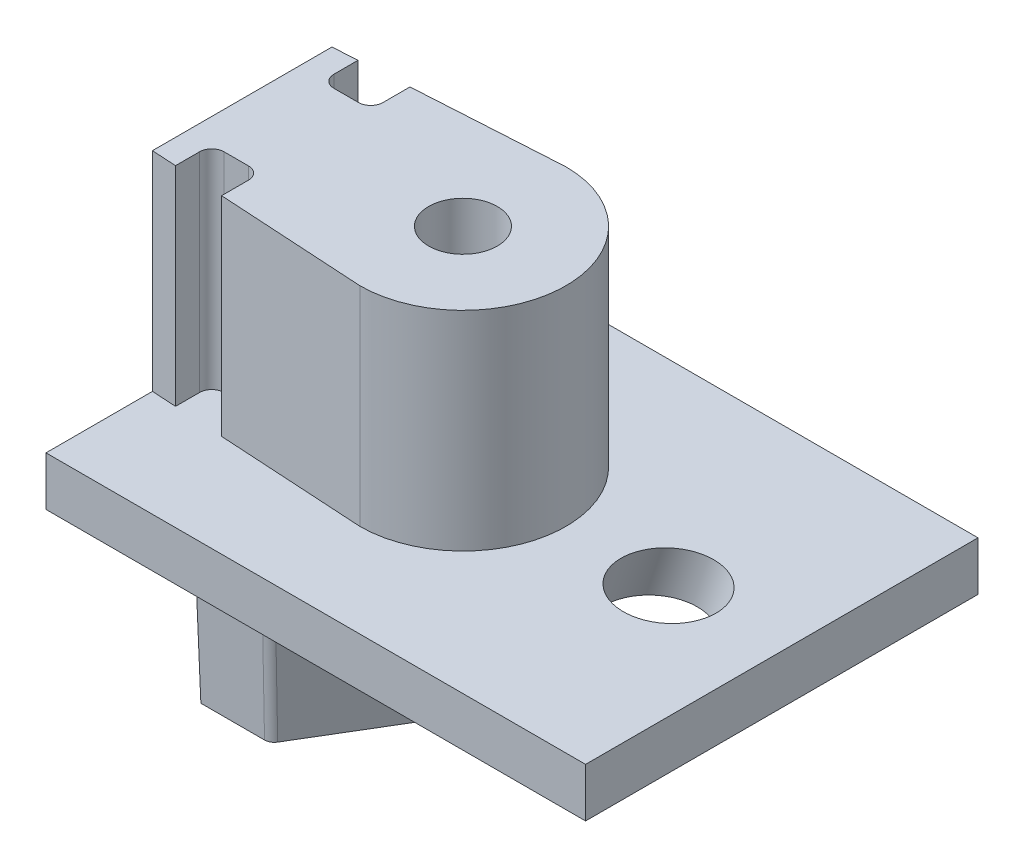
ISO-10303-21;
HEADER;
FILE_DESCRIPTION(('STEP AP214'),'2;1');
FILE_NAME('part.step','',(''),(''),'','','');
FILE_SCHEMA(('AUTOMOTIVE_DESIGN { 1 0 10303 214 1 1 1 1 }'));
ENDSEC;
DATA;
#1=APPLICATION_CONTEXT('core data for automotive mechanical design processes');
#2=APPLICATION_PROTOCOL_DEFINITION('international standard','automotive_design',2000,#1);
#3=PRODUCT_CONTEXT('',#1,'mechanical');
#4=PRODUCT('Part','Part','',(#3));
#5=PRODUCT_RELATED_PRODUCT_CATEGORY('part','',(#4));
#6=PRODUCT_DEFINITION_FORMATION('','',#4);
#7=PRODUCT_DEFINITION_CONTEXT('part definition',#1,'design');
#8=PRODUCT_DEFINITION('design','',#6,#7);
#9=PRODUCT_DEFINITION_SHAPE('','',#8);
#10=(LENGTH_UNIT() NAMED_UNIT(*) SI_UNIT(.MILLI.,.METRE.));
#11=(NAMED_UNIT(*) PLANE_ANGLE_UNIT() SI_UNIT($,.RADIAN.));
#12=(NAMED_UNIT(*) SI_UNIT($,.STERADIAN.) SOLID_ANGLE_UNIT());
#13=UNCERTAINTY_MEASURE_WITH_UNIT(LENGTH_MEASURE(1.E-05),#10,'distance_accuracy_value','');
#14=(GEOMETRIC_REPRESENTATION_CONTEXT(3) GLOBAL_UNCERTAINTY_ASSIGNED_CONTEXT((#13)) GLOBAL_UNIT_ASSIGNED_CONTEXT((#10,
#11,#12)) REPRESENTATION_CONTEXT('',''));
#15=CARTESIAN_POINT('',(0.,0.,0.));
#16=DIRECTION('',(0.,0.,1.));
#17=DIRECTION('',(1.,0.,0.));
#18=AXIS2_PLACEMENT_3D('',#15,#16,#17);
#19=CARTESIAN_POINT('',(0.,-0.5,0.));
#20=DIRECTION('',(0.,-1.,0.));
#21=DIRECTION('',(0.,0.,-1.));
#22=AXIS2_PLACEMENT_3D('',#19,#20,#21);
#23=PLANE('',#22);
#24=DIRECTION('',(-1.,0.,0.));
#25=VECTOR('',#24,1.);
#26=CARTESIAN_POINT('',(1.75,-0.5,-2.));
#27=LINE('',#26,#25);
#28=CARTESIAN_POINT('',(3.25,-0.5,-2.));
#29=VERTEX_POINT('',#28);
#30=CARTESIAN_POINT('',(-2.25,-0.5,-2.));
#31=VERTEX_POINT('',#30);
#32=EDGE_CURVE('E421',#29,#31,#27,.T.);
#33=ORIENTED_EDGE('',*,*,#32,.F.);
#34=DIRECTION('',(0.,0.,-1.));
#35=VECTOR('',#34,1.);
#36=CARTESIAN_POINT('',(3.25,-0.5,-2.));
#37=LINE('',#36,#35);
#38=CARTESIAN_POINT('',(3.25,-0.5,2.));
#39=VERTEX_POINT('',#38);
#40=EDGE_CURVE('E429',#39,#29,#37,.T.);
#41=ORIENTED_EDGE('',*,*,#40,.F.);
#42=DIRECTION('',(1.,0.,0.));
#43=VECTOR('',#42,1.);
#44=CARTESIAN_POINT('',(-2.25,-0.5,2.));
#45=LINE('',#44,#43);
#46=CARTESIAN_POINT('',(-2.25,-0.5,2.));
#47=VERTEX_POINT('',#46);
#48=EDGE_CURVE('E427',#47,#39,#45,.T.);
#49=ORIENTED_EDGE('',*,*,#48,.F.);
#50=DIRECTION('',(0.,0.,1.));
#51=VECTOR('',#50,1.);
#52=CARTESIAN_POINT('',(-2.25,-0.5,2.));
#53=LINE('',#52,#51);
#54=EDGE_CURVE('E423',#31,#47,#53,.T.);
#55=ORIENTED_EDGE('',*,*,#54,.F.);
#56=EDGE_LOOP('',(#33,#41,#49,#55));
#57=FACE_BOUND('',#56,.T.);
#58=CARTESIAN_POINT('',(1.92880187929405,-0.5,0.));
#59=DIRECTION('',(0.,-1.,0.));
#60=DIRECTION('',(1.,0.,0.));
#61=AXIS2_PLACEMENT_3D('',#58,#59,#60);
#62=ELLIPSE('',#61,0.484882574559151,0.46);
#63=CARTESIAN_POINT('',(2.4136844538532,-0.5,0.));
#64=VERTEX_POINT('',#63);
#65=EDGE_CURVE('E243',#64,#64,#62,.T.);
#66=ORIENTED_EDGE('',*,*,#65,.F.);
#67=EDGE_LOOP('',(#66));
#68=FACE_BOUND('',#67,.T.);
#69=DIRECTION('',(1.,0.,0.));
#70=VECTOR('',#69,1.);
#71=CARTESIAN_POINT('',(0.,-0.5,1.24781695285458));
#72=LINE('',#71,#70);
#73=CARTESIAN_POINT('',(-1.5,-0.5,1.24781695285457));
#74=VERTEX_POINT('',#73);
#75=CARTESIAN_POINT('',(-0.807801169409156,-0.5,1.24781695285457));
#76=VERTEX_POINT('',#75);
#77=EDGE_CURVE('E358',#74,#76,#72,.T.);
#78=ORIENTED_EDGE('',*,*,#77,.T.);
#79=CARTESIAN_POINT('',(-0.807908998304848,-0.5,1.14772168433824));
#80=DIRECTION('',(0.,-1.,0.));
#81=DIRECTION('',(-0.492698814983595,0.,-0.870199906753478));
#82=AXIS2_PLACEMENT_3D('',#79,#80,#81);
#83=ELLIPSE('',#82,0.100125789704708,0.1);
#84=CARTESIAN_POINT('',(-0.722133491163942,-0.5,1.19931273764352));
#85=VERTEX_POINT('',#84);
#86=EDGE_CURVE('E47',#76,#85,#83,.F.);
#87=ORIENTED_EDGE('',*,*,#86,.T.);
#88=DIRECTION('',(0.514495755427527,0.,-0.857492925712544));
#89=VECTOR('',#88,1.);
#90=CARTESIAN_POINT('',(-0.00187194748369955,-0.5,-0.00112316849021973));
#91=LINE('',#90,#89);
#92=CARTESIAN_POINT('',(-0.0661741084451111,-0.5,0.1060470997788));
#93=VERTEX_POINT('',#92);
#94=EDGE_CURVE('E356',#85,#93,#91,.T.);
#95=ORIENTED_EDGE('',*,*,#94,.T.);
#96=CARTESIAN_POINT('',(0.,-0.5,0.));
#97=DIRECTION('',(0.,-1.,0.));
#98=DIRECTION('',(0.,0.,-1.));
#99=AXIS2_PLACEMENT_3D('',#96,#97,#98);
#100=CIRCLE('',#99,0.125);
#101=CARTESIAN_POINT('',(-0.0661741084451112,-0.5,-0.1060470997788));
#102=VERTEX_POINT('',#101);
#103=EDGE_CURVE('E361',#93,#102,#100,.F.);
#104=ORIENTED_EDGE('',*,*,#103,.T.);
#105=DIRECTION('',(-0.514495755427526,0.,-0.857492925712544));
#106=VECTOR('',#105,1.);
#107=CARTESIAN_POINT('',(-0.00187194748369962,-0.5,0.00112316849021978));
#108=LINE('',#107,#106);
#109=CARTESIAN_POINT('',(-0.722133491163942,-0.5,-1.19931273764352));
#110=VERTEX_POINT('',#109);
#111=EDGE_CURVE('E353',#102,#110,#108,.T.);
#112=ORIENTED_EDGE('',*,*,#111,.T.);
#113=CARTESIAN_POINT('',(-0.807908998304848,-0.5,-1.14772168433824));
#114=DIRECTION('',(0.,-1.,0.));
#115=DIRECTION('',(-0.492698814983592,0.,0.87019990675348));
#116=AXIS2_PLACEMENT_3D('',#113,#114,#115);
#117=ELLIPSE('',#116,0.100125789704708,0.1);
#118=CARTESIAN_POINT('',(-0.807801169409156,-0.5,-1.24781695285457));
#119=VERTEX_POINT('',#118);
#120=EDGE_CURVE('E11',#110,#119,#117,.F.);
#121=ORIENTED_EDGE('',*,*,#120,.T.);
#122=DIRECTION('',(-1.,0.,0.));
#123=VECTOR('',#122,1.);
#124=CARTESIAN_POINT('',(0.,-0.5,-1.24781695285457));
#125=LINE('',#124,#123);
#126=CARTESIAN_POINT('',(-1.5,-0.5,-1.24781695285457));
#127=VERTEX_POINT('',#126);
#128=EDGE_CURVE('E351',#119,#127,#125,.T.);
#129=ORIENTED_EDGE('',*,*,#128,.T.);
#130=DIRECTION('',(0.,0.,-1.));
#131=VECTOR('',#130,1.);
#132=CARTESIAN_POINT('',(-1.5,-0.5,1.25));
#133=LINE('',#132,#131);
#134=EDGE_CURVE('E365',#74,#127,#133,.T.);
#135=ORIENTED_EDGE('',*,*,#134,.F.);
#136=EDGE_LOOP('',(#78,#87,#95,#104,#112,#121,#129,#135));
#137=FACE_BOUND('',#136,.T.);
#138=ADVANCED_FACE('F39',(#57,#68,#137),#23,.T.);
#139=CARTESIAN_POINT('',(-2.50000000000002,2.125,0.9));
#140=DIRECTION('',(0.0598922907279451,0.,-0.998204845465779));
#141=DIRECTION('',(-0.998204845465779,0.,-0.0598922907279451));
#142=AXIS2_PLACEMENT_3D('',#139,#140,#141);
#143=PLANE('',#142);
#144=DIRECTION('',(0.998204845465779,0.,0.0598922907279451));
#145=VECTOR('',#144,1.);
#146=CARTESIAN_POINT('',(-2.50000000000002,2.125,0.9));
#147=LINE('',#146,#145);
#148=CARTESIAN_POINT('',(-2.25,2.125,0.915000000000001));
#149=VERTEX_POINT('',#148);
#150=CARTESIAN_POINT('',(-2.,2.125,0.93));
#151=VERTEX_POINT('',#150);
#152=EDGE_CURVE('E282',#149,#151,#147,.T.);
#153=ORIENTED_EDGE('',*,*,#152,.F.);
#154=DIRECTION('',(0.,-1.,0.));
#155=VECTOR('',#154,1.);
#156=CARTESIAN_POINT('',(-2.25,2.125,0.915000000000001));
#157=LINE('',#156,#155);
#158=CARTESIAN_POINT('',(-2.25,0.,0.915000000000001));
#159=VERTEX_POINT('',#158);
#160=EDGE_CURVE('E230',#149,#159,#157,.T.);
#161=ORIENTED_EDGE('',*,*,#160,.T.);
#162=DIRECTION('',(0.998204845465779,0.,0.0598922907279451));
#163=VECTOR('',#162,1.);
#164=CARTESIAN_POINT('',(-2.50000000000002,0.,0.9));
#165=LINE('',#164,#163);
#166=CARTESIAN_POINT('',(-2.,0.,0.93));
#167=VERTEX_POINT('',#166);
#168=EDGE_CURVE('E257',#159,#167,#165,.T.);
#169=ORIENTED_EDGE('',*,*,#168,.T.);
#170=DIRECTION('',(0.,-1.,0.));
#171=VECTOR('',#170,1.);
#172=CARTESIAN_POINT('',(-2.,2.125,0.93));
#173=LINE('',#172,#171);
#174=EDGE_CURVE('E295',#151,#167,#173,.T.);
#175=ORIENTED_EDGE('',*,*,#174,.F.);
#176=EDGE_LOOP('',(#153,#161,#169,#175));
#177=FACE_BOUND('',#176,.T.);
#178=ADVANCED_FACE('F533',(#177),#143,.F.);
#179=CARTESIAN_POINT('',(-2.,2.125,0.93));
#180=DIRECTION('',(-1.,0.,0.));
#181=DIRECTION('',(0.,0.,1.));
#182=AXIS2_PLACEMENT_3D('',#179,#180,#181);
#183=PLANE('',#182);
#184=DIRECTION('',(0.,0.,-1.));
#185=VECTOR('',#184,1.);
#186=CARTESIAN_POINT('',(-2.,0.,0.93));
#187=LINE('',#186,#185);
#188=CARTESIAN_POINT('',(-2.,0.,0.685));
#189=VERTEX_POINT('',#188);
#190=EDGE_CURVE('E260',#167,#189,#187,.T.);
#191=ORIENTED_EDGE('',*,*,#190,.T.);
#192=DIRECTION('',(0.,-1.,0.));
#193=VECTOR('',#192,1.);
#194=CARTESIAN_POINT('',(-2.,2.125,0.685));
#195=LINE('',#194,#193);
#196=CARTESIAN_POINT('',(-2.,2.125,0.685));
#197=VERTEX_POINT('',#196);
#198=EDGE_CURVE('E303',#189,#197,#195,.F.);
#199=ORIENTED_EDGE('',*,*,#198,.T.);
#200=DIRECTION('',(0.,0.,-1.));
#201=VECTOR('',#200,1.);
#202=CARTESIAN_POINT('',(-2.,2.125,0.93));
#203=LINE('',#202,#201);
#204=EDGE_CURVE('E458',#151,#197,#203,.T.);
#205=ORIENTED_EDGE('',*,*,#204,.F.);
#206=ORIENTED_EDGE('',*,*,#174,.T.);
#207=EDGE_LOOP('',(#191,#199,#205,#206));
#208=FACE_BOUND('',#207,.T.);
#209=ADVANCED_FACE('F530',(#208),#183,.F.);
#210=CARTESIAN_POINT('',(-1.5,2.125,0.56));
#211=DIRECTION('',(0.,0.,1.));
#212=DIRECTION('',(1.,0.,0.));
#213=AXIS2_PLACEMENT_3D('',#210,#211,#212);
#214=PLANE('',#213);
#215=DIRECTION('',(-1.,0.,0.));
#216=VECTOR('',#215,1.);
#217=CARTESIAN_POINT('',(-1.5,2.125,0.56));
#218=LINE('',#217,#216);
#219=CARTESIAN_POINT('',(-1.625,2.125,0.56));
#220=VERTEX_POINT('',#219);
#221=CARTESIAN_POINT('',(-1.875,2.125,0.56));
#222=VERTEX_POINT('',#221);
#223=EDGE_CURVE('E461',#220,#222,#218,.T.);
#224=ORIENTED_EDGE('',*,*,#223,.T.);
#225=DIRECTION('',(0.,-1.,0.));
#226=VECTOR('',#225,1.);
#227=CARTESIAN_POINT('',(-1.875,2.125,0.56));
#228=LINE('',#227,#226);
#229=CARTESIAN_POINT('',(-1.875,0.,0.56));
#230=VERTEX_POINT('',#229);
#231=EDGE_CURVE('E300',#222,#230,#228,.T.);
#232=ORIENTED_EDGE('',*,*,#231,.T.);
#233=DIRECTION('',(-1.,0.,0.));
#234=VECTOR('',#233,1.);
#235=CARTESIAN_POINT('',(-1.5,0.,0.56));
#236=LINE('',#235,#234);
#237=CARTESIAN_POINT('',(-1.625,0.,0.56));
#238=VERTEX_POINT('',#237);
#239=EDGE_CURVE('E264',#238,#230,#236,.T.);
#240=ORIENTED_EDGE('',*,*,#239,.F.);
#241=DIRECTION('',(0.,-1.,0.));
#242=VECTOR('',#241,1.);
#243=CARTESIAN_POINT('',(-1.625,2.125,0.56));
#244=LINE('',#243,#242);
#245=EDGE_CURVE('E298',#238,#220,#244,.F.);
#246=ORIENTED_EDGE('',*,*,#245,.T.);
#247=EDGE_LOOP('',(#224,#232,#240,#246));
#248=FACE_BOUND('',#247,.T.);
#249=ADVANCED_FACE('F520',(#248),#214,.T.);
#250=CARTESIAN_POINT('',(-1.5,2.125,0.56));
#251=DIRECTION('',(1.,0.,0.));
#252=DIRECTION('',(0.,0.,-1.));
#253=AXIS2_PLACEMENT_3D('',#250,#251,#252);
#254=PLANE('',#253);
#255=DIRECTION('',(0.,0.,1.));
#256=VECTOR('',#255,1.);
#257=CARTESIAN_POINT('',(-1.5,2.125,0.56));
#258=LINE('',#257,#256);
#259=CARTESIAN_POINT('',(-1.5,2.125,0.685));
#260=VERTEX_POINT('',#259);
#261=CARTESIAN_POINT('',(-1.5,2.125,0.96));
#262=VERTEX_POINT('',#261);
#263=EDGE_CURVE('E464',#260,#262,#258,.T.);
#264=ORIENTED_EDGE('',*,*,#263,.F.);
#265=DIRECTION('',(0.,-1.,0.));
#266=VECTOR('',#265,1.);
#267=CARTESIAN_POINT('',(-1.5,2.125,0.685));
#268=LINE('',#267,#266);
#269=CARTESIAN_POINT('',(-1.5,0.,0.685));
#270=VERTEX_POINT('',#269);
#271=EDGE_CURVE('E305',#260,#270,#268,.T.);
#272=ORIENTED_EDGE('',*,*,#271,.T.);
#273=DIRECTION('',(0.,0.,1.));
#274=VECTOR('',#273,1.);
#275=CARTESIAN_POINT('',(-1.5,0.,0.56));
#276=LINE('',#275,#274);
#277=CARTESIAN_POINT('',(-1.5,0.,0.96));
#278=VERTEX_POINT('',#277);
#279=EDGE_CURVE('E266',#270,#278,#276,.T.);
#280=ORIENTED_EDGE('',*,*,#279,.T.);
#281=DIRECTION('',(0.,-1.,0.));
#282=VECTOR('',#281,1.);
#283=CARTESIAN_POINT('',(-1.5,2.125,0.96));
#284=LINE('',#283,#282);
#285=EDGE_CURVE('E292',#262,#278,#284,.T.);
#286=ORIENTED_EDGE('',*,*,#285,.F.);
#287=EDGE_LOOP('',(#264,#272,#280,#286));
#288=FACE_BOUND('',#287,.T.);
#289=ADVANCED_FACE('F510',(#288),#254,.F.);
#290=CARTESIAN_POINT('',(0.,2.125,1.05));
#291=DIRECTION('',(-0.0598922907279466,0.,0.998204845465779));
#292=DIRECTION('',(0.998204845465779,0.,0.0598922907279466));
#293=AXIS2_PLACEMENT_3D('',#290,#291,#292);
#294=PLANE('',#293);
#295=DIRECTION('',(-0.998204845465779,0.,-0.0598922907279466));
#296=VECTOR('',#295,1.);
#297=CARTESIAN_POINT('',(0.,0.,1.05));
#298=LINE('',#297,#296);
#299=CARTESIAN_POINT('',(0.,0.,1.05));
#300=VERTEX_POINT('',#299);
#301=EDGE_CURVE('E269',#300,#278,#298,.T.);
#302=ORIENTED_EDGE('',*,*,#301,.F.);
#303=DIRECTION('',(0.,-1.,0.));
#304=VECTOR('',#303,1.);
#305=CARTESIAN_POINT('',(0.,2.125,1.05));
#306=LINE('',#305,#304);
#307=CARTESIAN_POINT('',(0.,2.125,1.05));
#308=VERTEX_POINT('',#307);
#309=EDGE_CURVE('E289',#308,#300,#306,.T.);
#310=ORIENTED_EDGE('',*,*,#309,.F.);
#311=DIRECTION('',(-0.998204845465779,0.,-0.0598922907279466));
#312=VECTOR('',#311,1.);
#313=CARTESIAN_POINT('',(0.,2.125,1.05));
#314=LINE('',#313,#312);
#315=EDGE_CURVE('E466',#308,#262,#314,.T.);
#316=ORIENTED_EDGE('',*,*,#315,.T.);
#317=ORIENTED_EDGE('',*,*,#285,.T.);
#318=EDGE_LOOP('',(#302,#310,#316,#317));
#319=FACE_BOUND('',#318,.T.);
#320=ADVANCED_FACE('F506',(#319),#294,.T.);
#321=CARTESIAN_POINT('',(0.,2.125,0.));
#322=DIRECTION('',(0.,-1.,0.));
#323=DIRECTION('',(0.,0.,-1.));
#324=AXIS2_PLACEMENT_3D('',#321,#322,#323);
#325=CYLINDRICAL_SURFACE('',#324,1.05);
#326=CARTESIAN_POINT('',(0.,0.,0.));
#327=DIRECTION('',(0.,-1.,0.));
#328=DIRECTION('',(0.,0.,-1.));
#329=AXIS2_PLACEMENT_3D('',#326,#327,#328);
#330=CIRCLE('',#329,1.05);
#331=CARTESIAN_POINT('',(0.,0.,-1.05));
#332=VERTEX_POINT('',#331);
#333=EDGE_CURVE('E271',#332,#300,#330,.T.);
#334=ORIENTED_EDGE('',*,*,#333,.F.);
#335=DIRECTION('',(0.,-1.,0.));
#336=VECTOR('',#335,1.);
#337=CARTESIAN_POINT('',(0.,2.125,-1.05));
#338=LINE('',#337,#336);
#339=CARTESIAN_POINT('',(0.,2.125,-1.05));
#340=VERTEX_POINT('',#339);
#341=EDGE_CURVE('E286',#340,#332,#338,.T.);
#342=ORIENTED_EDGE('',*,*,#341,.F.);
#343=CARTESIAN_POINT('',(0.,2.125,0.));
#344=DIRECTION('',(0.,-1.,0.));
#345=DIRECTION('',(0.,0.,-1.));
#346=AXIS2_PLACEMENT_3D('',#343,#344,#345);
#347=CIRCLE('',#346,1.05);
#348=EDGE_CURVE('E469',#340,#308,#347,.T.);
#349=ORIENTED_EDGE('',*,*,#348,.T.);
#350=ORIENTED_EDGE('',*,*,#309,.T.);
#351=EDGE_LOOP('',(#334,#342,#349,#350));
#352=FACE_BOUND('',#351,.T.);
#353=ADVANCED_FACE('F502',(#352),#325,.T.);
#354=CARTESIAN_POINT('',(-1.5,2.125,-0.96));
#355=DIRECTION('',(-0.0598922907279466,0.,-0.998204845465779));
#356=DIRECTION('',(-0.998204845465779,0.,0.0598922907279466));
#357=AXIS2_PLACEMENT_3D('',#354,#355,#356);
#358=PLANE('',#357);
#359=DIRECTION('',(0.998204845465779,0.,-0.0598922907279466));
#360=VECTOR('',#359,1.);
#361=CARTESIAN_POINT('',(-1.5,0.,-0.96));
#362=LINE('',#361,#360);
#363=CARTESIAN_POINT('',(-1.5,0.,-0.96));
#364=VERTEX_POINT('',#363);
#365=EDGE_CURVE('E273',#364,#332,#362,.T.);
#366=ORIENTED_EDGE('',*,*,#365,.F.);
#367=DIRECTION('',(0.,-1.,0.));
#368=VECTOR('',#367,1.);
#369=CARTESIAN_POINT('',(-1.5,2.125,-0.96));
#370=LINE('',#369,#368);
#371=CARTESIAN_POINT('',(-1.5,2.125,-0.96));
#372=VERTEX_POINT('',#371);
#373=EDGE_CURVE('E251',#372,#364,#370,.T.);
#374=ORIENTED_EDGE('',*,*,#373,.F.);
#375=DIRECTION('',(0.998204845465779,0.,-0.0598922907279466));
#376=VECTOR('',#375,1.);
#377=CARTESIAN_POINT('',(-1.5,2.125,-0.96));
#378=LINE('',#377,#376);
#379=EDGE_CURVE('E472',#372,#340,#378,.T.);
#380=ORIENTED_EDGE('',*,*,#379,.T.);
#381=ORIENTED_EDGE('',*,*,#341,.T.);
#382=EDGE_LOOP('',(#366,#374,#380,#381));
#383=FACE_BOUND('',#382,.T.);
#384=ADVANCED_FACE('F498',(#383),#358,.T.);
#385=CARTESIAN_POINT('',(-1.5,2.125,-0.96));
#386=DIRECTION('',(1.,0.,0.));
#387=DIRECTION('',(0.,0.,-1.));
#388=AXIS2_PLACEMENT_3D('',#385,#386,#387);
#389=PLANE('',#388);
#390=DIRECTION('',(0.,0.,1.));
#391=VECTOR('',#390,1.);
#392=CARTESIAN_POINT('',(-1.5,0.,-0.96));
#393=LINE('',#392,#391);
#394=CARTESIAN_POINT('',(-1.5,0.,-0.685));
#395=VERTEX_POINT('',#394);
#396=EDGE_CURVE('E275',#364,#395,#393,.T.);
#397=ORIENTED_EDGE('',*,*,#396,.T.);
#398=DIRECTION('',(0.,-1.,0.));
#399=VECTOR('',#398,1.);
#400=CARTESIAN_POINT('',(-1.5,2.125,-0.685));
#401=LINE('',#400,#399);
#402=CARTESIAN_POINT('',(-1.5,2.125,-0.685));
#403=VERTEX_POINT('',#402);
#404=EDGE_CURVE('E313',#395,#403,#401,.F.);
#405=ORIENTED_EDGE('',*,*,#404,.T.);
#406=DIRECTION('',(0.,0.,1.));
#407=VECTOR('',#406,1.);
#408=CARTESIAN_POINT('',(-1.5,2.125,-0.96));
#409=LINE('',#408,#407);
#410=EDGE_CURVE('E475',#372,#403,#409,.T.);
#411=ORIENTED_EDGE('',*,*,#410,.F.);
#412=ORIENTED_EDGE('',*,*,#373,.T.);
#413=EDGE_LOOP('',(#397,#405,#411,#412));
#414=FACE_BOUND('',#413,.T.);
#415=ADVANCED_FACE('F493',(#414),#389,.F.);
#416=CARTESIAN_POINT('',(-2.,2.125,-0.56));
#417=DIRECTION('',(0.,0.,-1.));
#418=DIRECTION('',(-1.,0.,0.));
#419=AXIS2_PLACEMENT_3D('',#416,#417,#418);
#420=PLANE('',#419);
#421=DIRECTION('',(1.,0.,0.));
#422=VECTOR('',#421,1.);
#423=CARTESIAN_POINT('',(-2.,2.125,-0.56));
#424=LINE('',#423,#422);
#425=CARTESIAN_POINT('',(-1.875,2.125,-0.56));
#426=VERTEX_POINT('',#425);
#427=CARTESIAN_POINT('',(-1.625,2.125,-0.56));
#428=VERTEX_POINT('',#427);
#429=EDGE_CURVE('E253',#426,#428,#424,.T.);
#430=ORIENTED_EDGE('',*,*,#429,.T.);
#431=DIRECTION('',(0.,-1.,0.));
#432=VECTOR('',#431,1.);
#433=CARTESIAN_POINT('',(-1.625,2.125,-0.56));
#434=LINE('',#433,#432);
#435=CARTESIAN_POINT('',(-1.625,0.,-0.56));
#436=VERTEX_POINT('',#435);
#437=EDGE_CURVE('E310',#428,#436,#434,.T.);
#438=ORIENTED_EDGE('',*,*,#437,.T.);
#439=DIRECTION('',(1.,0.,0.));
#440=VECTOR('',#439,1.);
#441=CARTESIAN_POINT('',(-2.,0.,-0.56));
#442=LINE('',#441,#440);
#443=CARTESIAN_POINT('',(-1.875,0.,-0.56));
#444=VERTEX_POINT('',#443);
#445=EDGE_CURVE('E278',#444,#436,#442,.T.);
#446=ORIENTED_EDGE('',*,*,#445,.F.);
#447=DIRECTION('',(0.,-1.,0.));
#448=VECTOR('',#447,1.);
#449=CARTESIAN_POINT('',(-1.875,2.125,-0.56));
#450=LINE('',#449,#448);
#451=EDGE_CURVE('E308',#444,#426,#450,.F.);
#452=ORIENTED_EDGE('',*,*,#451,.T.);
#453=EDGE_LOOP('',(#430,#438,#446,#452));
#454=FACE_BOUND('',#453,.T.);
#455=ADVANCED_FACE('F481',(#454),#420,.T.);
#456=CARTESIAN_POINT('',(-2.,2.125,-0.93));
#457=DIRECTION('',(1.,0.,0.));
#458=DIRECTION('',(0.,0.,-1.));
#459=AXIS2_PLACEMENT_3D('',#456,#457,#458);
#460=PLANE('',#459);
#461=DIRECTION('',(0.,0.,1.));
#462=VECTOR('',#461,1.);
#463=CARTESIAN_POINT('',(-2.,2.125,-0.93));
#464=LINE('',#463,#462);
#465=CARTESIAN_POINT('',(-2.,2.125,-0.93));
#466=VERTEX_POINT('',#465);
#467=CARTESIAN_POINT('',(-2.,2.125,-0.685));
#468=VERTEX_POINT('',#467);
#469=EDGE_CURVE('E248',#466,#468,#464,.T.);
#470=ORIENTED_EDGE('',*,*,#469,.T.);
#471=DIRECTION('',(0.,-1.,0.));
#472=VECTOR('',#471,1.);
#473=CARTESIAN_POINT('',(-2.,0.,-0.685));
#474=LINE('',#473,#472);
#475=CARTESIAN_POINT('',(-2.,0.,-0.685));
#476=VERTEX_POINT('',#475);
#477=EDGE_CURVE('E315',#468,#476,#474,.T.);
#478=ORIENTED_EDGE('',*,*,#477,.T.);
#479=DIRECTION('',(0.,0.,1.));
#480=VECTOR('',#479,1.);
#481=CARTESIAN_POINT('',(-2.,0.,-0.93));
#482=LINE('',#481,#480);
#483=CARTESIAN_POINT('',(-2.,0.,-0.93));
#484=VERTEX_POINT('',#483);
#485=EDGE_CURVE('E280',#484,#476,#482,.T.);
#486=ORIENTED_EDGE('',*,*,#485,.F.);
#487=DIRECTION('',(0.,-1.,0.));
#488=VECTOR('',#487,1.);
#489=CARTESIAN_POINT('',(-2.,2.125,-0.93));
#490=LINE('',#489,#488);
#491=EDGE_CURVE('E249',#466,#484,#490,.T.);
#492=ORIENTED_EDGE('',*,*,#491,.F.);
#493=EDGE_LOOP('',(#470,#478,#486,#492));
#494=FACE_BOUND('',#493,.T.);
#495=ADVANCED_FACE('F728',(#494),#460,.T.);
#496=CARTESIAN_POINT('',(-2.50000000000002,2.125,-0.9));
#497=DIRECTION('',(-0.0598922907279451,0.,-0.998204845465779));
#498=DIRECTION('',(-0.998204845465779,0.,0.0598922907279451));
#499=AXIS2_PLACEMENT_3D('',#496,#497,#498);
#500=PLANE('',#499);
#501=DIRECTION('',(0.,-1.,0.));
#502=VECTOR('',#501,1.);
#503=CARTESIAN_POINT('',(-2.25,2.125,-0.915000000000001));
#504=LINE('',#503,#502);
#505=CARTESIAN_POINT('',(-2.25,2.125,-0.915));
#506=VERTEX_POINT('',#505);
#507=CARTESIAN_POINT('',(-2.25,0.,-0.915));
#508=VERTEX_POINT('',#507);
#509=EDGE_CURVE('E227',#506,#508,#504,.T.);
#510=ORIENTED_EDGE('',*,*,#509,.F.);
#511=DIRECTION('',(0.998204845465779,0.,-0.0598922907279451));
#512=VECTOR('',#511,1.);
#513=CARTESIAN_POINT('',(-2.50000000000002,2.125,-0.9));
#514=LINE('',#513,#512);
#515=EDGE_CURVE('E240',#506,#466,#514,.T.);
#516=ORIENTED_EDGE('',*,*,#515,.T.);
#517=ORIENTED_EDGE('',*,*,#491,.T.);
#518=DIRECTION('',(0.998204845465779,0.,-0.0598922907279451));
#519=VECTOR('',#518,1.);
#520=CARTESIAN_POINT('',(-2.50000000000002,0.,-0.9));
#521=LINE('',#520,#519);
#522=EDGE_CURVE('E242',#508,#484,#521,.T.);
#523=ORIENTED_EDGE('',*,*,#522,.F.);
#524=EDGE_LOOP('',(#510,#516,#517,#523));
#525=FACE_BOUND('',#524,.T.);
#526=ADVANCED_FACE('F238',(#525),#500,.T.);
#527=CARTESIAN_POINT('',(0.,2.125,0.));
#528=DIRECTION('',(0.,-1.,0.));
#529=DIRECTION('',(0.,0.,-1.));
#530=AXIS2_PLACEMENT_3D('',#527,#528,#529);
#531=PLANE('',#530);
#532=CARTESIAN_POINT('',(0.,2.125,0.));
#533=DIRECTION('',(0.,1.,0.));
#534=DIRECTION('',(0.,0.,1.));
#535=AXIS2_PLACEMENT_3D('',#532,#533,#534);
#536=CIRCLE('',#535,0.35);
#537=CARTESIAN_POINT('',(0.,2.125,0.35));
#538=VERTEX_POINT('',#537);
#539=EDGE_CURVE('E446',#538,#538,#536,.T.);
#540=ORIENTED_EDGE('',*,*,#539,.F.);
#541=EDGE_LOOP('',(#540));
#542=FACE_BOUND('',#541,.T.);
#543=ORIENTED_EDGE('',*,*,#515,.F.);
#544=DIRECTION('',(0.,0.,1.));
#545=VECTOR('',#544,1.);
#546=CARTESIAN_POINT('',(-2.25,2.125,2.));
#547=LINE('',#546,#545);
#548=EDGE_CURVE('E223',#506,#149,#547,.T.);
#549=ORIENTED_EDGE('',*,*,#548,.T.);
#550=ORIENTED_EDGE('',*,*,#152,.T.);
#551=ORIENTED_EDGE('',*,*,#204,.T.);
#552=CARTESIAN_POINT('',(-1.875,2.125,0.685));
#553=DIRECTION('',(0.,-1.,0.));
#554=DIRECTION('',(0.,0.,-1.));
#555=AXIS2_PLACEMENT_3D('',#552,#553,#554);
#556=CIRCLE('',#555,0.125);
#557=EDGE_CURVE('E320',#197,#222,#556,.T.);
#558=ORIENTED_EDGE('',*,*,#557,.T.);
#559=ORIENTED_EDGE('',*,*,#223,.F.);
#560=CARTESIAN_POINT('',(-1.625,2.125,0.685));
#561=DIRECTION('',(0.,-1.,0.));
#562=DIRECTION('',(0.,0.,-1.));
#563=AXIS2_PLACEMENT_3D('',#560,#561,#562);
#564=CIRCLE('',#563,0.125);
#565=EDGE_CURVE('E324',#220,#260,#564,.T.);
#566=ORIENTED_EDGE('',*,*,#565,.T.);
#567=ORIENTED_EDGE('',*,*,#263,.T.);
#568=ORIENTED_EDGE('',*,*,#315,.F.);
#569=ORIENTED_EDGE('',*,*,#348,.F.);
#570=ORIENTED_EDGE('',*,*,#379,.F.);
#571=ORIENTED_EDGE('',*,*,#410,.T.);
#572=CARTESIAN_POINT('',(-1.625,2.125,-0.685));
#573=DIRECTION('',(0.,-1.,0.));
#574=DIRECTION('',(0.,0.,-1.));
#575=AXIS2_PLACEMENT_3D('',#572,#573,#574);
#576=CIRCLE('',#575,0.125);
#577=EDGE_CURVE('E328',#403,#428,#576,.T.);
#578=ORIENTED_EDGE('',*,*,#577,.T.);
#579=ORIENTED_EDGE('',*,*,#429,.F.);
#580=CARTESIAN_POINT('',(-1.875,2.125,-0.685));
#581=DIRECTION('',(0.,-1.,0.));
#582=DIRECTION('',(0.,0.,-1.));
#583=AXIS2_PLACEMENT_3D('',#580,#581,#582);
#584=CIRCLE('',#583,0.125);
#585=EDGE_CURVE('E332',#426,#468,#584,.T.);
#586=ORIENTED_EDGE('',*,*,#585,.T.);
#587=ORIENTED_EDGE('',*,*,#469,.F.);
#588=EDGE_LOOP('',(#543,#549,#550,#551,#558,#559,#566,#567,#568,#569,#570,#571,#578,#579,#586,#587));
#589=FACE_BOUND('',#588,.T.);
#590=ADVANCED_FACE('F246',(#542,#589),#531,.F.);
#591=CARTESIAN_POINT('',(0.,0.,0.));
#592=DIRECTION('',(0.,1.,0.));
#593=DIRECTION('',(0.,0.,1.));
#594=AXIS2_PLACEMENT_3D('',#591,#592,#593);
#595=CYLINDRICAL_SURFACE('',#594,0.35);
#596=CARTESIAN_POINT('',(0.,0.,0.));
#597=DIRECTION('',(0.,1.,0.));
#598=DIRECTION('',(0.,0.,1.));
#599=AXIS2_PLACEMENT_3D('',#596,#597,#598);
#600=CIRCLE('',#599,0.35);
#601=CARTESIAN_POINT('',(0.,0.,0.35));
#602=VERTEX_POINT('',#601);
#603=EDGE_CURVE('E261',#602,#602,#600,.T.);
#604=ORIENTED_EDGE('',*,*,#603,.F.);
#605=EDGE_LOOP('',(#604));
#606=FACE_BOUND('',#605,.T.);
#607=ORIENTED_EDGE('',*,*,#539,.T.);
#608=EDGE_LOOP('',(#607));
#609=FACE_BOUND('',#608,.T.);
#610=ADVANCED_FACE('F710',(#606,#609),#595,.F.);
#611=CARTESIAN_POINT('',(-1.875,2.125,0.685));
#612=DIRECTION('',(0.,-1.,0.));
#613=DIRECTION('',(0.,0.,-1.));
#614=AXIS2_PLACEMENT_3D('',#611,#612,#613);
#615=CYLINDRICAL_SURFACE('',#614,0.125);
#616=ORIENTED_EDGE('',*,*,#557,.F.);
#617=ORIENTED_EDGE('',*,*,#198,.F.);
#618=CARTESIAN_POINT('',(-1.875,0.,0.685));
#619=DIRECTION('',(0.,-1.,0.));
#620=DIRECTION('',(0.,0.,-1.));
#621=AXIS2_PLACEMENT_3D('',#618,#619,#620);
#622=CIRCLE('',#621,0.125);
#623=EDGE_CURVE('E318',#230,#189,#622,.F.);
#624=ORIENTED_EDGE('',*,*,#623,.F.);
#625=ORIENTED_EDGE('',*,*,#231,.F.);
#626=EDGE_LOOP('',(#616,#617,#624,#625));
#627=FACE_BOUND('',#626,.T.);
#628=ADVANCED_FACE('F526',(#627),#615,.F.);
#629=CARTESIAN_POINT('',(-1.625,2.125,0.685));
#630=DIRECTION('',(0.,-1.,0.));
#631=DIRECTION('',(0.,0.,-1.));
#632=AXIS2_PLACEMENT_3D('',#629,#630,#631);
#633=CYLINDRICAL_SURFACE('',#632,0.125);
#634=ORIENTED_EDGE('',*,*,#565,.F.);
#635=ORIENTED_EDGE('',*,*,#245,.F.);
#636=CARTESIAN_POINT('',(-1.625,0.,0.685));
#637=DIRECTION('',(0.,-1.,0.));
#638=DIRECTION('',(0.,0.,-1.));
#639=AXIS2_PLACEMENT_3D('',#636,#637,#638);
#640=CIRCLE('',#639,0.125);
#641=EDGE_CURVE('E322',#270,#238,#640,.F.);
#642=ORIENTED_EDGE('',*,*,#641,.F.);
#643=ORIENTED_EDGE('',*,*,#271,.F.);
#644=EDGE_LOOP('',(#634,#635,#642,#643));
#645=FACE_BOUND('',#644,.T.);
#646=ADVANCED_FACE('F517',(#645),#633,.F.);
#647=CARTESIAN_POINT('',(-1.625,2.125,-0.685));
#648=DIRECTION('',(0.,-1.,0.));
#649=DIRECTION('',(0.,0.,-1.));
#650=AXIS2_PLACEMENT_3D('',#647,#648,#649);
#651=CYLINDRICAL_SURFACE('',#650,0.125);
#652=ORIENTED_EDGE('',*,*,#577,.F.);
#653=ORIENTED_EDGE('',*,*,#404,.F.);
#654=CARTESIAN_POINT('',(-1.625,0.,-0.685));
#655=DIRECTION('',(0.,-1.,0.));
#656=DIRECTION('',(0.,0.,-1.));
#657=AXIS2_PLACEMENT_3D('',#654,#655,#656);
#658=CIRCLE('',#657,0.125);
#659=EDGE_CURVE('E326',#436,#395,#658,.F.);
#660=ORIENTED_EDGE('',*,*,#659,.F.);
#661=ORIENTED_EDGE('',*,*,#437,.F.);
#662=EDGE_LOOP('',(#652,#653,#660,#661));
#663=FACE_BOUND('',#662,.T.);
#664=ADVANCED_FACE('F488',(#663),#651,.F.);
#665=CARTESIAN_POINT('',(-1.875,2.125,-0.685));
#666=DIRECTION('',(0.,1.,0.));
#667=DIRECTION('',(0.,0.,1.));
#668=AXIS2_PLACEMENT_3D('',#665,#666,#667);
#669=CYLINDRICAL_SURFACE('',#668,0.125);
#670=ORIENTED_EDGE('',*,*,#585,.F.);
#671=ORIENTED_EDGE('',*,*,#451,.F.);
#672=CARTESIAN_POINT('',(-1.875,0.,-0.685));
#673=DIRECTION('',(0.,-1.,0.));
#674=DIRECTION('',(0.,0.,-1.));
#675=AXIS2_PLACEMENT_3D('',#672,#673,#674);
#676=CIRCLE('',#675,0.125);
#677=EDGE_CURVE('E330',#476,#444,#676,.F.);
#678=ORIENTED_EDGE('',*,*,#677,.F.);
#679=ORIENTED_EDGE('',*,*,#477,.F.);
#680=EDGE_LOOP('',(#670,#671,#678,#679));
#681=FACE_BOUND('',#680,.T.);
#682=ADVANCED_FACE('F576',(#681),#669,.F.);
#683=CARTESIAN_POINT('',(0.,0.,0.));
#684=DIRECTION('',(0.,-1.,0.));
#685=DIRECTION('',(0.,0.,-1.));
#686=AXIS2_PLACEMENT_3D('',#683,#684,#685);
#687=PLANE('',#686);
#688=CARTESIAN_POINT('',(0.,0.,0.));
#689=DIRECTION('',(0.,1.,0.));
#690=DIRECTION('',(0.,0.,1.));
#691=AXIS2_PLACEMENT_3D('',#688,#689,#690);
#692=CIRCLE('',#691,0.125);
#693=CARTESIAN_POINT('',(0.,0.,0.125));
#694=VERTEX_POINT('',#693);
#695=EDGE_CURVE('E415',#694,#694,#692,.T.);
#696=ORIENTED_EDGE('',*,*,#695,.F.);
#697=EDGE_LOOP('',(#696));
#698=FACE_BOUND('',#697,.T.);
#699=ORIENTED_EDGE('',*,*,#603,.T.);
#700=EDGE_LOOP('',(#699));
#701=FACE_BOUND('',#700,.T.);
#702=ADVANCED_FACE('F573',(#698,#701),#687,.F.);
#703=CARTESIAN_POINT('',(2.09546854596071,0.,0.));
#704=DIRECTION('',(0.,-1.,0.));
#705=DIRECTION('',(1.,0.,0.));
#706=AXIS2_PLACEMENT_3D('',#703,#704,#705);
#707=ELLIPSE('',#706,0.484882574559151,0.46);
#708=CARTESIAN_POINT('',(2.58035112051986,0.,0.));
#709=VERTEX_POINT('',#708);
#710=EDGE_CURVE('E337',#709,#709,#707,.T.);
#711=ORIENTED_EDGE('',*,*,#710,.T.);
#712=EDGE_LOOP('',(#711));
#713=FACE_BOUND('',#712,.T.);
#714=DIRECTION('',(0.,0.,1.));
#715=VECTOR('',#714,1.);
#716=CARTESIAN_POINT('',(-2.25,0.,2.));
#717=LINE('',#716,#715);
#718=CARTESIAN_POINT('',(-2.25,0.,-2.));
#719=VERTEX_POINT('',#718);
#720=EDGE_CURVE('E436',#719,#508,#717,.T.);
#721=ORIENTED_EDGE('',*,*,#720,.T.);
#722=ORIENTED_EDGE('',*,*,#522,.T.);
#723=ORIENTED_EDGE('',*,*,#485,.T.);
#724=ORIENTED_EDGE('',*,*,#677,.T.);
#725=ORIENTED_EDGE('',*,*,#445,.T.);
#726=ORIENTED_EDGE('',*,*,#659,.T.);
#727=ORIENTED_EDGE('',*,*,#396,.F.);
#728=ORIENTED_EDGE('',*,*,#365,.T.);
#729=ORIENTED_EDGE('',*,*,#333,.T.);
#730=ORIENTED_EDGE('',*,*,#301,.T.);
#731=ORIENTED_EDGE('',*,*,#279,.F.);
#732=ORIENTED_EDGE('',*,*,#641,.T.);
#733=ORIENTED_EDGE('',*,*,#239,.T.);
#734=ORIENTED_EDGE('',*,*,#623,.T.);
#735=ORIENTED_EDGE('',*,*,#190,.F.);
#736=ORIENTED_EDGE('',*,*,#168,.F.);
#737=CARTESIAN_POINT('',(-2.25,0.,2.));
#738=VERTEX_POINT('',#737);
#739=EDGE_CURVE('E435',#159,#738,#717,.T.);
#740=ORIENTED_EDGE('',*,*,#739,.T.);
#741=DIRECTION('',(1.,0.,0.));
#742=VECTOR('',#741,1.);
#743=CARTESIAN_POINT('',(3.25,0.,2.));
#744=LINE('',#743,#742);
#745=CARTESIAN_POINT('',(3.25,0.,2.));
#746=VERTEX_POINT('',#745);
#747=EDGE_CURVE('E438',#738,#746,#744,.T.);
#748=ORIENTED_EDGE('',*,*,#747,.T.);
#749=DIRECTION('',(0.,0.,-1.));
#750=VECTOR('',#749,1.);
#751=CARTESIAN_POINT('',(3.25,0.,-2.));
#752=LINE('',#751,#750);
#753=CARTESIAN_POINT('',(3.25,0.,-2.));
#754=VERTEX_POINT('',#753);
#755=EDGE_CURVE('E424',#746,#754,#752,.T.);
#756=ORIENTED_EDGE('',*,*,#755,.T.);
#757=DIRECTION('',(-1.,0.,0.));
#758=VECTOR('',#757,1.);
#759=CARTESIAN_POINT('',(-2.25,0.,-2.));
#760=LINE('',#759,#758);
#761=EDGE_CURVE('E418',#754,#719,#760,.T.);
#762=ORIENTED_EDGE('',*,*,#761,.T.);
#763=EDGE_LOOP('',(#721,#722,#723,#724,#725,#726,#727,#728,#729,#730,#731,#732,#733,#734,#735,
#736,#740,#748,#756,#762));
#764=FACE_BOUND('',#763,.T.);
#765=ADVANCED_FACE('F491',(#713,#764),#687,.F.);
#766=CARTESIAN_POINT('',(3.25,-0.5,-2.));
#767=DIRECTION('',(1.,0.,0.));
#768=DIRECTION('',(0.,0.,-1.));
#769=AXIS2_PLACEMENT_3D('',#766,#767,#768);
#770=PLANE('',#769);
#771=ORIENTED_EDGE('',*,*,#755,.F.);
#772=DIRECTION('',(0.,1.,0.));
#773=VECTOR('',#772,1.);
#774=CARTESIAN_POINT('',(3.25,-0.5,2.));
#775=LINE('',#774,#773);
#776=EDGE_CURVE('E447',#39,#746,#775,.T.);
#777=ORIENTED_EDGE('',*,*,#776,.F.);
#778=ORIENTED_EDGE('',*,*,#40,.T.);
#779=DIRECTION('',(0.,1.,0.));
#780=VECTOR('',#779,1.);
#781=CARTESIAN_POINT('',(3.25,-0.5,-2.));
#782=LINE('',#781,#780);
#783=EDGE_CURVE('E443',#29,#754,#782,.T.);
#784=ORIENTED_EDGE('',*,*,#783,.T.);
#785=EDGE_LOOP('',(#771,#777,#778,#784));
#786=FACE_BOUND('',#785,.T.);
#787=ADVANCED_FACE('F547',(#786),#770,.T.);
#788=CARTESIAN_POINT('',(3.25,-0.5,2.));
#789=DIRECTION('',(0.,0.,1.));
#790=DIRECTION('',(1.,0.,0.));
#791=AXIS2_PLACEMENT_3D('',#788,#789,#790);
#792=PLANE('',#791);
#793=ORIENTED_EDGE('',*,*,#747,.F.);
#794=DIRECTION('',(0.,1.,0.));
#795=VECTOR('',#794,1.);
#796=CARTESIAN_POINT('',(-2.25,-0.5,2.));
#797=LINE('',#796,#795);
#798=EDGE_CURVE('E449',#47,#738,#797,.T.);
#799=ORIENTED_EDGE('',*,*,#798,.F.);
#800=ORIENTED_EDGE('',*,*,#48,.T.);
#801=ORIENTED_EDGE('',*,*,#776,.T.);
#802=EDGE_LOOP('',(#793,#799,#800,#801));
#803=FACE_BOUND('',#802,.T.);
#804=ADVANCED_FACE('F537',(#803),#792,.T.);
#805=CARTESIAN_POINT('',(-2.25,-0.5,2.));
#806=DIRECTION('',(-1.,0.,0.));
#807=DIRECTION('',(0.,0.,1.));
#808=AXIS2_PLACEMENT_3D('',#805,#806,#807);
#809=PLANE('',#808);
#810=ORIENTED_EDGE('',*,*,#720,.F.);
#811=DIRECTION('',(0.,1.,0.));
#812=VECTOR('',#811,1.);
#813=CARTESIAN_POINT('',(-2.25,-0.5,-2.));
#814=LINE('',#813,#812);
#815=EDGE_CURVE('E432',#31,#719,#814,.T.);
#816=ORIENTED_EDGE('',*,*,#815,.F.);
#817=ORIENTED_EDGE('',*,*,#54,.T.);
#818=ORIENTED_EDGE('',*,*,#798,.T.);
#819=ORIENTED_EDGE('',*,*,#739,.F.);
#820=ORIENTED_EDGE('',*,*,#160,.F.);
#821=ORIENTED_EDGE('',*,*,#548,.F.);
#822=ORIENTED_EDGE('',*,*,#509,.T.);
#823=EDGE_LOOP('',(#810,#816,#817,#818,#819,#820,#821,#822));
#824=FACE_BOUND('',#823,.T.);
#825=ADVANCED_FACE('F226',(#824),#809,.T.);
#826=CARTESIAN_POINT('',(-2.25,-0.5,-2.));
#827=DIRECTION('',(0.,0.,-1.));
#828=DIRECTION('',(-1.,0.,0.));
#829=AXIS2_PLACEMENT_3D('',#826,#827,#828);
#830=PLANE('',#829);
#831=ORIENTED_EDGE('',*,*,#761,.F.);
#832=ORIENTED_EDGE('',*,*,#783,.F.);
#833=ORIENTED_EDGE('',*,*,#32,.T.);
#834=ORIENTED_EDGE('',*,*,#815,.T.);
#835=EDGE_LOOP('',(#831,#832,#833,#834));
#836=FACE_BOUND('',#835,.T.);
#837=ADVANCED_FACE('F549',(#836),#830,.T.);
#838=CARTESIAN_POINT('',(0.,-0.5,0.));
#839=DIRECTION('',(0.,1.,0.));
#840=DIRECTION('',(0.,0.,1.));
#841=AXIS2_PLACEMENT_3D('',#838,#839,#840);
#842=CYLINDRICAL_SURFACE('',#841,0.125);
#843=ORIENTED_EDGE('',*,*,#695,.T.);
#844=EDGE_LOOP('',(#843));
#845=FACE_BOUND('',#844,.T.);
#846=CARTESIAN_POINT('',(0.,-0.5,0.));
#847=DIRECTION('',(0.,1.,0.));
#848=DIRECTION('',(0.,0.,1.));
#849=AXIS2_PLACEMENT_3D('',#846,#847,#848);
#850=CIRCLE('',#849,0.125);
#851=EDGE_CURVE('E416',#102,#93,#850,.T.);
#852=ORIENTED_EDGE('',*,*,#851,.F.);
#853=ORIENTED_EDGE('',*,*,#103,.F.);
#854=EDGE_LOOP('',(#852,#853));
#855=FACE_BOUND('',#854,.T.);
#856=ADVANCED_FACE('F551',(#845,#855),#842,.F.);
#857=CARTESIAN_POINT('',(1.48592169136464,-1.82864056378822,0.));
#858=DIRECTION('',(0.316227766016838,0.948683298050514,0.));
#859=DIRECTION('',(-0.948683298050514,0.316227766016838,0.));
#860=AXIS2_PLACEMENT_3D('',#857,#858,#859);
#861=CYLINDRICAL_SURFACE('',#860,0.46);
#862=ORIENTED_EDGE('',*,*,#65,.T.);
#863=EDGE_LOOP('',(#862));
#864=FACE_BOUND('',#863,.T.);
#865=ORIENTED_EDGE('',*,*,#710,.F.);
#866=EDGE_LOOP('',(#865));
#867=FACE_BOUND('',#866,.T.);
#868=ADVANCED_FACE('F558',(#864,#867),#861,.F.);
#869=CARTESIAN_POINT('',(0.,-0.5,0.));
#870=DIRECTION('',(0.,-1.,0.));
#871=DIRECTION('',(0.,0.,-1.));
#872=AXIS2_PLACEMENT_3D('',#869,#870,#871);
#873=PLANE('',#872);
#874=ORIENTED_EDGE('',*,*,#851,.T.);
#875=CARTESIAN_POINT('',(-0.00254584857783146,-0.5,0.));
#876=VERTEX_POINT('',#875);
#877=EDGE_CURVE('E355',#93,#876,#91,.T.);
#878=ORIENTED_EDGE('',*,*,#877,.T.);
#879=DIRECTION('',(0.514495755427526,0.,0.857492925712544));
#880=VECTOR('',#879,1.);
#881=CARTESIAN_POINT('',(-0.00187194748369963,-0.5,0.00112316849021978));
#882=LINE('',#881,#880);
#883=EDGE_CURVE('E366',#102,#876,#882,.T.);
#884=ORIENTED_EDGE('',*,*,#883,.F.);
#885=EDGE_LOOP('',(#874,#878,#884));
#886=FACE_BOUND('',#885,.T.);
#887=ADVANCED_FACE('F611',(#886),#873,.F.);
#888=CARTESIAN_POINT('',(-1.5,-2.25,1.25));
#889=DIRECTION('',(1.,0.,0.));
#890=DIRECTION('',(0.,0.,-1.));
#891=AXIS2_PLACEMENT_3D('',#888,#889,#890);
#892=PLANE('',#891);
#893=ORIENTED_EDGE('',*,*,#134,.T.);
#894=DIRECTION('',(0.,-0.999048221581857,0.0436193873653431));
#895=VECTOR('',#894,1.);
#896=CARTESIAN_POINT('',(-1.5,-2.25,-1.17141030276467));
#897=LINE('',#896,#895);
#898=CARTESIAN_POINT('',(-1.5,-2.25,-1.17141030276467));
#899=VERTEX_POINT('',#898);
#900=EDGE_CURVE('E349',#127,#899,#897,.T.);
#901=ORIENTED_EDGE('',*,*,#900,.T.);
#902=DIRECTION('',(0.,0.,-1.));
#903=VECTOR('',#902,1.);
#904=CARTESIAN_POINT('',(-1.5,-2.25,1.25));
#905=LINE('',#904,#903);
#906=CARTESIAN_POINT('',(-1.5,-2.25,1.17141030276467));
#907=VERTEX_POINT('',#906);
#908=EDGE_CURVE('E234',#907,#899,#905,.T.);
#909=ORIENTED_EDGE('',*,*,#908,.F.);
#910=DIRECTION('',(0.,0.999048221581857,0.043619387365343));
#911=VECTOR('',#910,1.);
#912=CARTESIAN_POINT('',(-1.5,-2.25,1.17141030276467));
#913=LINE('',#912,#911);
#914=EDGE_CURVE('E347',#907,#74,#913,.T.);
#915=ORIENTED_EDGE('',*,*,#914,.T.);
#916=EDGE_LOOP('',(#893,#901,#909,#915));
#917=FACE_BOUND('',#916,.T.);
#918=ADVANCED_FACE('F407',(#917),#892,.F.);
#919=CARTESIAN_POINT('',(0.,-2.25,0.));
#920=DIRECTION('',(0.,-1.,0.));
#921=DIRECTION('',(0.,0.,-1.));
#922=AXIS2_PLACEMENT_3D('',#919,#920,#921);
#923=PLANE('',#922);
#924=DIRECTION('',(-0.514495755427527,0.,0.857492925712544));
#925=VECTOR('',#924,1.);
#926=CARTESIAN_POINT('',(-0.81739010941319,-2.25,1.20956593435209));
#927=LINE('',#926,#925);
#928=CARTESIAN_POINT('',(-0.0916505488019383,-2.25,0.));
#929=VERTEX_POINT('',#928);
#930=CARTESIAN_POINT('',(-0.765394201334104,-2.25,1.12290608755361));
#931=VERTEX_POINT('',#930);
#932=EDGE_CURVE('E339',#929,#931,#927,.T.);
#933=ORIENTED_EDGE('',*,*,#932,.T.);
#934=CARTESIAN_POINT('',(-0.85116970847501,-2.25,1.07131503424833));
#935=DIRECTION('',(0.,-1.,0.));
#936=DIRECTION('',(-0.492698814983595,0.,-0.870199906753478));
#937=AXIS2_PLACEMENT_3D('',#934,#935,#936);
#938=ELLIPSE('',#937,0.100125789704708,0.1);
#939=CARTESIAN_POINT('',(-0.851061879579318,-2.25,1.17141030276467));
#940=VERTEX_POINT('',#939);
#941=EDGE_CURVE('E375',#931,#940,#938,.T.);
#942=ORIENTED_EDGE('',*,*,#941,.T.);
#943=DIRECTION('',(-1.,0.,0.));
#944=VECTOR('',#943,1.);
#945=CARTESIAN_POINT('',(-1.5,-2.25,1.17141030276467));
#946=LINE('',#945,#944);
#947=EDGE_CURVE('E334',#940,#907,#946,.T.);
#948=ORIENTED_EDGE('',*,*,#947,.T.);
#949=ORIENTED_EDGE('',*,*,#908,.T.);
#950=DIRECTION('',(1.,0.,0.));
#951=VECTOR('',#950,1.);
#952=CARTESIAN_POINT('',(-0.75,-2.25,-1.17141030276467));
#953=LINE('',#952,#951);
#954=CARTESIAN_POINT('',(-0.851061879579317,-2.25,-1.17141030276467));
#955=VERTEX_POINT('',#954);
#956=EDGE_CURVE('E344',#899,#955,#953,.T.);
#957=ORIENTED_EDGE('',*,*,#956,.T.);
#958=CARTESIAN_POINT('',(-0.851169708475009,-2.25,-1.07131503424833));
#959=DIRECTION('',(0.,-1.,0.));
#960=DIRECTION('',(-0.492698814983592,0.,0.87019990675348));
#961=AXIS2_PLACEMENT_3D('',#958,#959,#960);
#962=ELLIPSE('',#961,0.100125789704708,0.1);
#963=CARTESIAN_POINT('',(-0.765394201334103,-2.25,-1.12290608755361));
#964=VERTEX_POINT('',#963);
#965=EDGE_CURVE('E373',#955,#964,#962,.T.);
#966=ORIENTED_EDGE('',*,*,#965,.T.);
#967=DIRECTION('',(0.514495755427526,0.,0.857492925712544));
#968=VECTOR('',#967,1.);
#969=CARTESIAN_POINT('',(-0.0673901094131898,-2.25,0.040434065647914));
#970=LINE('',#969,#968);
#971=EDGE_CURVE('E342',#964,#929,#970,.T.);
#972=ORIENTED_EDGE('',*,*,#971,.T.);
#973=EDGE_LOOP('',(#933,#942,#948,#949,#957,#966,#972));
#974=FACE_BOUND('',#973,.T.);
#975=ADVANCED_FACE('F399',(#974),#923,.T.);
#976=CARTESIAN_POINT('',(0.,-2.25,1.17141030276467));
#977=DIRECTION('',(0.,-0.043619387365343,0.999048221581857));
#978=DIRECTION('',(1.,0.,0.));
#979=AXIS2_PLACEMENT_3D('',#976,#977,#978);
#980=PLANE('',#979);
#981=ORIENTED_EDGE('',*,*,#947,.F.);
#982=DIRECTION('',(-0.0246893491521282,-0.998743683270022,-0.0436060909354965));
#983=VECTOR('',#982,1.);
#984=CARTESIAN_POINT('',(-0.850543102928473,-2.22901423403803,1.17232656109422));
#985=LINE('',#984,#983);
#986=EDGE_CURVE('E377',#940,#76,#985,.F.);
#987=ORIENTED_EDGE('',*,*,#986,.T.);
#988=ORIENTED_EDGE('',*,*,#77,.F.);
#989=ORIENTED_EDGE('',*,*,#914,.F.);
#990=EDGE_LOOP('',(#981,#987,#988,#989));
#991=FACE_BOUND('',#990,.T.);
#992=ADVANCED_FACE('F404',(#991),#980,.T.);
#993=CARTESIAN_POINT('',(-0.06739010941319,-2.25,-0.040434065647914));
#994=DIRECTION('',(0.856676782452141,-0.0436193873653432,0.514006069471285));
#995=DIRECTION('',(0.514495755427527,0.,-0.857492925712544));
#996=AXIS2_PLACEMENT_3D('',#993,#994,#995);
#997=PLANE('',#996);
#998=ORIENTED_EDGE('',*,*,#94,.F.);
#999=DIRECTION('',(-0.0246893491521282,-0.998743683270022,-0.0436060909354965));
#1000=VECTOR('',#999,1.);
#1001=CARTESIAN_POINT('',(-0.766221182188591,-2.28345336888044,1.12144548192482));
#1002=LINE('',#1001,#1000);
#1003=EDGE_CURVE('E370',#85,#931,#1002,.T.);
#1004=ORIENTED_EDGE('',*,*,#1003,.T.);
#1005=ORIENTED_EDGE('',*,*,#932,.F.);
#1006=DIRECTION('',(0.0508510975230853,0.998706246040695,0.));
#1007=VECTOR('',#1006,1.);
#1008=CARTESIAN_POINT('',(-0.0915878153300176,-2.2487679260961,0.));
#1009=LINE('',#1008,#1007);
#1010=EDGE_CURVE('E362',#876,#929,#1009,.F.);
#1011=ORIENTED_EDGE('',*,*,#1010,.F.);
#1012=ORIENTED_EDGE('',*,*,#877,.F.);
#1013=EDGE_LOOP('',(#998,#1004,#1005,#1011,#1012));
#1014=FACE_BOUND('',#1013,.T.);
#1015=ADVANCED_FACE('F392',(#1014),#997,.T.);
#1016=CARTESIAN_POINT('',(-0.0673901094131899,-2.25,0.0404340656479139));
#1017=DIRECTION('',(0.856676782452141,-0.0436193873653431,-0.514006069471285));
#1018=DIRECTION('',(-0.514495755427526,0.,-0.857492925712544));
#1019=AXIS2_PLACEMENT_3D('',#1016,#1017,#1018);
#1020=PLANE('',#1019);
#1021=ORIENTED_EDGE('',*,*,#971,.F.);
#1022=DIRECTION('',(-0.024689349152128,-0.998743683270022,0.0436060909354966));
#1023=VECTOR('',#1022,1.);
#1024=CARTESIAN_POINT('',(-0.76622118218859,-2.28345336888044,-1.12144548192482));
#1025=LINE('',#1024,#1023);
#1026=EDGE_CURVE('E54',#964,#110,#1025,.F.);
#1027=ORIENTED_EDGE('',*,*,#1026,.T.);
#1028=ORIENTED_EDGE('',*,*,#111,.F.);
#1029=ORIENTED_EDGE('',*,*,#883,.T.);
#1030=ORIENTED_EDGE('',*,*,#1010,.T.);
#1031=EDGE_LOOP('',(#1021,#1027,#1028,#1029,#1030));
#1032=FACE_BOUND('',#1031,.T.);
#1033=ADVANCED_FACE('F645',(#1032),#1020,.T.);
#1034=CARTESIAN_POINT('',(0.,-2.25,-1.17141030276467));
#1035=DIRECTION('',(0.,-0.0436193873653431,-0.999048221581857));
#1036=DIRECTION('',(-1.,0.,0.));
#1037=AXIS2_PLACEMENT_3D('',#1034,#1035,#1036);
#1038=PLANE('',#1037);
#1039=ORIENTED_EDGE('',*,*,#128,.F.);
#1040=DIRECTION('',(-0.0246893491521281,-0.998743683270022,0.0436060909354966));
#1041=VECTOR('',#1040,1.);
#1042=CARTESIAN_POINT('',(-0.850543102928472,-2.22901423403803,-1.17232656109422));
#1043=LINE('',#1042,#1041);
#1044=EDGE_CURVE('E379',#119,#955,#1043,.T.);
#1045=ORIENTED_EDGE('',*,*,#1044,.T.);
#1046=ORIENTED_EDGE('',*,*,#956,.F.);
#1047=ORIENTED_EDGE('',*,*,#900,.F.);
#1048=EDGE_LOOP('',(#1039,#1045,#1046,#1047));
#1049=FACE_BOUND('',#1048,.T.);
#1050=ADVANCED_FACE('F652',(#1049),#1038,.T.);
#1051=CARTESIAN_POINT('',(-0.851888860433805,-2.27909143014391,1.07004487497769));
#1052=DIRECTION('',(-0.0246893491521282,-0.998743683270022,-0.0436060909354965));
#1053=DIRECTION('',(0.,0.043619387365343,-0.999048221581857));
#1054=AXIS2_PLACEMENT_3D('',#1051,#1052,#1053);
#1055=CYLINDRICAL_SURFACE('',#1054,0.1);
#1056=ORIENTED_EDGE('',*,*,#86,.F.);
#1057=ORIENTED_EDGE('',*,*,#986,.F.);
#1058=ORIENTED_EDGE('',*,*,#941,.F.);
#1059=ORIENTED_EDGE('',*,*,#1003,.F.);
#1060=EDGE_LOOP('',(#1056,#1057,#1058,#1059));
#1061=FACE_BOUND('',#1060,.T.);
#1062=ADVANCED_FACE('F396',(#1061),#1055,.T.);
#1063=CARTESIAN_POINT('',(-0.850543102928472,-2.2246522953015,-1.07242173893604));
#1064=DIRECTION('',(-0.024689349152128,-0.998743683270022,0.0436060909354966));
#1065=DIRECTION('',(0.,-0.0436193873653431,-0.999048221581857));
#1066=AXIS2_PLACEMENT_3D('',#1063,#1064,#1065);
#1067=CYLINDRICAL_SURFACE('',#1066,0.1);
#1068=ORIENTED_EDGE('',*,*,#120,.F.);
#1069=ORIENTED_EDGE('',*,*,#1026,.F.);
#1070=ORIENTED_EDGE('',*,*,#965,.F.);
#1071=ORIENTED_EDGE('',*,*,#1044,.F.);
#1072=EDGE_LOOP('',(#1068,#1069,#1070,#1071));
#1073=FACE_BOUND('',#1072,.T.);
#1074=ADVANCED_FACE('F41',(#1073),#1067,.T.);
#1075=CLOSED_SHELL('',(#138,#178,#209,#249,#289,#320,#353,#384,#415,#455,#495,#526,#590,#610,
#628,#646,#664,#682,#702,#765,#787,#804,#825,#837,#856,#868,#887,#918,#975,#992,#1015,#1033,
#1050,#1062,#1074));
#1076=MANIFOLD_SOLID_BREP('B2',#1075);
#1077=ADVANCED_BREP_SHAPE_REPRESENTATION('',(#18,#1076),#14);
#1078=SHAPE_DEFINITION_REPRESENTATION(#9,#1077);
ENDSEC;
END-ISO-10303-21;
